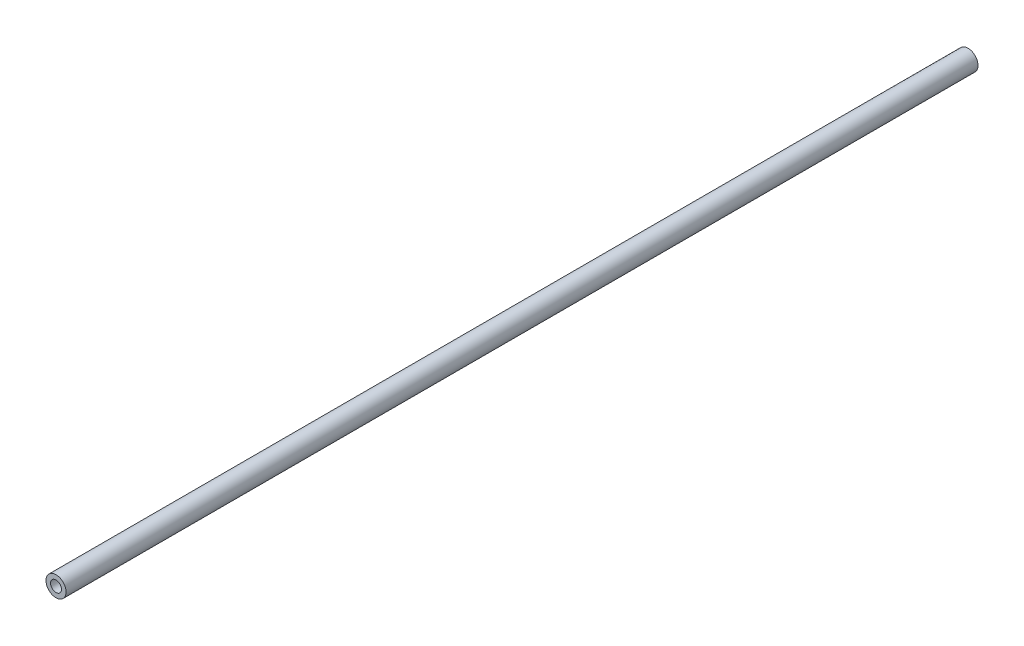
ISO-10303-21;
HEADER;
FILE_DESCRIPTION(('STEP AP214'),'2;1');
FILE_NAME('part.step','',(''),(''),'','','');
FILE_SCHEMA(('AUTOMOTIVE_DESIGN { 1 0 10303 214 1 1 1 1 }'));
ENDSEC;
DATA;
#1=APPLICATION_CONTEXT('core data for automotive mechanical design processes');
#2=APPLICATION_PROTOCOL_DEFINITION('international standard','automotive_design',2000,#1);
#3=PRODUCT_CONTEXT('',#1,'mechanical');
#4=PRODUCT('Part','Part','',(#3));
#5=PRODUCT_RELATED_PRODUCT_CATEGORY('part','',(#4));
#6=PRODUCT_DEFINITION_FORMATION('','',#4);
#7=PRODUCT_DEFINITION_CONTEXT('part definition',#1,'design');
#8=PRODUCT_DEFINITION('design','',#6,#7);
#9=PRODUCT_DEFINITION_SHAPE('','',#8);
#10=(LENGTH_UNIT() NAMED_UNIT(*) SI_UNIT(.MILLI.,.METRE.));
#11=(NAMED_UNIT(*) PLANE_ANGLE_UNIT() SI_UNIT($,.RADIAN.));
#12=(NAMED_UNIT(*) SI_UNIT($,.STERADIAN.) SOLID_ANGLE_UNIT());
#13=UNCERTAINTY_MEASURE_WITH_UNIT(LENGTH_MEASURE(1.E-05),#10,'distance_accuracy_value','');
#14=(GEOMETRIC_REPRESENTATION_CONTEXT(3) GLOBAL_UNCERTAINTY_ASSIGNED_CONTEXT((#13)) GLOBAL_UNIT_ASSIGNED_CONTEXT((#10,
#11,#12)) REPRESENTATION_CONTEXT('',''));
#15=CARTESIAN_POINT('',(0.,0.,0.));
#16=DIRECTION('',(0.,0.,1.));
#17=DIRECTION('',(1.,0.,0.));
#18=AXIS2_PLACEMENT_3D('',#15,#16,#17);
#19=CARTESIAN_POINT('',(0.,0.,1000.));
#20=DIRECTION('',(0.,0.,1.));
#21=DIRECTION('',(1.,0.,0.));
#22=AXIS2_PLACEMENT_3D('',#19,#20,#21);
#23=PLANE('',#22);
#24=CARTESIAN_POINT('',(0.,0.,1000.));
#25=DIRECTION('',(0.,0.,1.));
#26=DIRECTION('',(1.,0.,0.));
#27=AXIS2_PLACEMENT_3D('',#24,#25,#26);
#28=CIRCLE('',#27,11.);
#29=CARTESIAN_POINT('',(11.,0.,1000.));
#30=VERTEX_POINT('',#29);
#31=EDGE_CURVE('E10',#30,#30,#28,.T.);
#32=ORIENTED_EDGE('',*,*,#31,.T.);
#33=EDGE_LOOP('',(#32));
#34=FACE_BOUND('',#33,.T.);
#35=CARTESIAN_POINT('',(0.,0.,1000.));
#36=DIRECTION('',(0.,0.,1.));
#37=DIRECTION('',(1.,0.,0.));
#38=AXIS2_PLACEMENT_3D('',#35,#36,#37);
#39=CIRCLE('',#38,6.);
#40=CARTESIAN_POINT('',(6.,0.,1000.));
#41=VERTEX_POINT('',#40);
#42=EDGE_CURVE('E42',#41,#41,#39,.T.);
#43=ORIENTED_EDGE('',*,*,#42,.F.);
#44=EDGE_LOOP('',(#43));
#45=FACE_BOUND('',#44,.T.);
#46=ADVANCED_FACE('F31',(#34,#45),#23,.T.);
#47=CARTESIAN_POINT('',(0.,0.,0.));
#48=DIRECTION('',(0.,0.,1.));
#49=DIRECTION('',(1.,0.,0.));
#50=AXIS2_PLACEMENT_3D('',#47,#48,#49);
#51=PLANE('',#50);
#52=CARTESIAN_POINT('',(0.,0.,0.));
#53=DIRECTION('',(0.,0.,1.));
#54=DIRECTION('',(1.,0.,0.));
#55=AXIS2_PLACEMENT_3D('',#52,#53,#54);
#56=CIRCLE('',#55,11.);
#57=CARTESIAN_POINT('',(11.,0.,0.));
#58=VERTEX_POINT('',#57);
#59=EDGE_CURVE('E35',#58,#58,#56,.T.);
#60=ORIENTED_EDGE('',*,*,#59,.F.);
#61=EDGE_LOOP('',(#60));
#62=FACE_BOUND('',#61,.T.);
#63=CARTESIAN_POINT('',(0.,0.,0.));
#64=DIRECTION('',(0.,0.,1.));
#65=DIRECTION('',(1.,0.,0.));
#66=AXIS2_PLACEMENT_3D('',#63,#64,#65);
#67=CIRCLE('',#66,6.);
#68=CARTESIAN_POINT('',(6.,0.,0.));
#69=VERTEX_POINT('',#68);
#70=EDGE_CURVE('E44',#69,#69,#67,.T.);
#71=ORIENTED_EDGE('',*,*,#70,.T.);
#72=EDGE_LOOP('',(#71));
#73=FACE_BOUND('',#72,.T.);
#74=ADVANCED_FACE('F54',(#62,#73),#51,.F.);
#75=CARTESIAN_POINT('',(0.,0.,1000.));
#76=DIRECTION('',(0.,0.,-1.));
#77=DIRECTION('',(-1.,0.,0.));
#78=AXIS2_PLACEMENT_3D('',#75,#76,#77);
#79=CYLINDRICAL_SURFACE('',#78,11.);
#80=ORIENTED_EDGE('',*,*,#31,.F.);
#81=EDGE_LOOP('',(#80));
#82=FACE_BOUND('',#81,.T.);
#83=ORIENTED_EDGE('',*,*,#59,.T.);
#84=EDGE_LOOP('',(#83));
#85=FACE_BOUND('',#84,.T.);
#86=ADVANCED_FACE('F33',(#82,#85),#79,.T.);
#87=CARTESIAN_POINT('',(0.,0.,1000.));
#88=DIRECTION('',(0.,0.,-1.));
#89=DIRECTION('',(-1.,0.,0.));
#90=AXIS2_PLACEMENT_3D('',#87,#88,#89);
#91=CYLINDRICAL_SURFACE('',#90,6.);
#92=ORIENTED_EDGE('',*,*,#42,.T.);
#93=EDGE_LOOP('',(#92));
#94=FACE_BOUND('',#93,.T.);
#95=ORIENTED_EDGE('',*,*,#70,.F.);
#96=EDGE_LOOP('',(#95));
#97=FACE_BOUND('',#96,.T.);
#98=ADVANCED_FACE('F50',(#94,#97),#91,.F.);
#99=CLOSED_SHELL('',(#46,#74,#86,#98));
#100=MANIFOLD_SOLID_BREP('B2',#99);
#101=ADVANCED_BREP_SHAPE_REPRESENTATION('',(#18,#100),#14);
#102=SHAPE_DEFINITION_REPRESENTATION(#9,#101);
ENDSEC;
END-ISO-10303-21;
